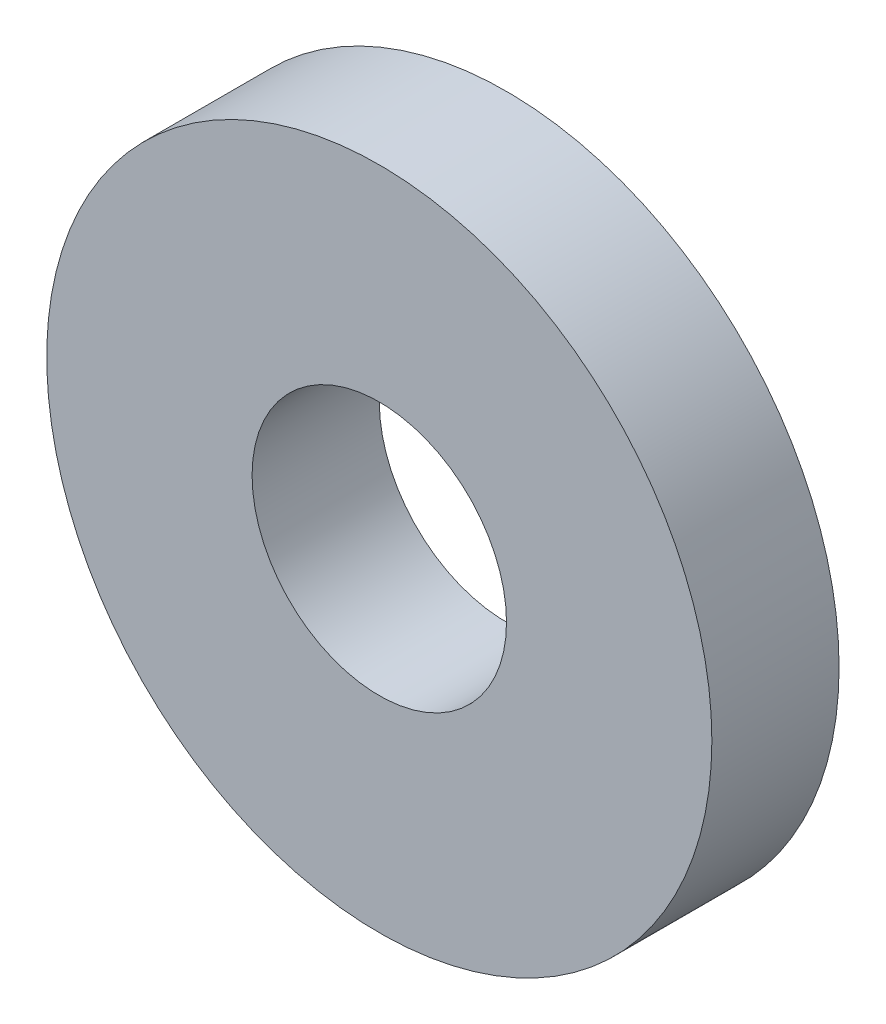
ISO-10303-21;
HEADER;
FILE_DESCRIPTION(('STEP AP214'),'2;1');
FILE_NAME('part.step','',(''),(''),'','','');
FILE_SCHEMA(('AUTOMOTIVE_DESIGN { 1 0 10303 214 1 1 1 1 }'));
ENDSEC;
DATA;
#1=APPLICATION_CONTEXT('core data for automotive mechanical design processes');
#2=APPLICATION_PROTOCOL_DEFINITION('international standard','automotive_design',2000,#1);
#3=PRODUCT_CONTEXT('',#1,'mechanical');
#4=PRODUCT('Part','Part','',(#3));
#5=PRODUCT_RELATED_PRODUCT_CATEGORY('part','',(#4));
#6=PRODUCT_DEFINITION_FORMATION('','',#4);
#7=PRODUCT_DEFINITION_CONTEXT('part definition',#1,'design');
#8=PRODUCT_DEFINITION('design','',#6,#7);
#9=PRODUCT_DEFINITION_SHAPE('','',#8);
#10=(LENGTH_UNIT() NAMED_UNIT(*) SI_UNIT(.MILLI.,.METRE.));
#11=(NAMED_UNIT(*) PLANE_ANGLE_UNIT() SI_UNIT($,.RADIAN.));
#12=(NAMED_UNIT(*) SI_UNIT($,.STERADIAN.) SOLID_ANGLE_UNIT());
#13=UNCERTAINTY_MEASURE_WITH_UNIT(LENGTH_MEASURE(1.E-05),#10,'distance_accuracy_value','');
#14=(GEOMETRIC_REPRESENTATION_CONTEXT(3) GLOBAL_UNCERTAINTY_ASSIGNED_CONTEXT((#13)) GLOBAL_UNIT_ASSIGNED_CONTEXT((#10,
#11,#12)) REPRESENTATION_CONTEXT('',''));
#15=CARTESIAN_POINT('',(0.,0.,0.));
#16=DIRECTION('',(0.,0.,1.));
#17=DIRECTION('',(1.,0.,0.));
#18=AXIS2_PLACEMENT_3D('',#15,#16,#17);
#19=CARTESIAN_POINT('',(8.,0.,1.5875));
#20=DIRECTION('',(0.,0.,1.));
#21=DIRECTION('',(1.,0.,0.));
#22=AXIS2_PLACEMENT_3D('',#19,#20,#21);
#23=PLANE('',#22);
#24=CARTESIAN_POINT('',(8.,0.,1.5875));
#25=DIRECTION('',(0.,0.,1.));
#26=DIRECTION('',(1.,0.,0.));
#27=AXIS2_PLACEMENT_3D('',#24,#25,#26);
#28=CIRCLE('',#27,4.15);
#29=CARTESIAN_POINT('',(12.15,0.,1.5875));
#30=VERTEX_POINT('',#29);
#31=EDGE_CURVE('E10',#30,#30,#28,.T.);
#32=ORIENTED_EDGE('',*,*,#31,.T.);
#33=EDGE_LOOP('',(#32));
#34=FACE_BOUND('',#33,.T.);
#35=CARTESIAN_POINT('',(8.,0.,1.5875));
#36=DIRECTION('',(0.,0.,1.));
#37=DIRECTION('',(1.,0.,0.));
#38=AXIS2_PLACEMENT_3D('',#35,#36,#37);
#39=CIRCLE('',#38,1.5875);
#40=CARTESIAN_POINT('',(9.5875,0.,1.5875));
#41=VERTEX_POINT('',#40);
#42=EDGE_CURVE('E42',#41,#41,#39,.T.);
#43=ORIENTED_EDGE('',*,*,#42,.F.);
#44=EDGE_LOOP('',(#43));
#45=FACE_BOUND('',#44,.T.);
#46=ADVANCED_FACE('F31',(#34,#45),#23,.T.);
#47=CARTESIAN_POINT('',(8.,0.,0.));
#48=DIRECTION('',(0.,0.,1.));
#49=DIRECTION('',(1.,0.,0.));
#50=AXIS2_PLACEMENT_3D('',#47,#48,#49);
#51=PLANE('',#50);
#52=CARTESIAN_POINT('',(8.,0.,0.));
#53=DIRECTION('',(0.,0.,1.));
#54=DIRECTION('',(1.,0.,0.));
#55=AXIS2_PLACEMENT_3D('',#52,#53,#54);
#56=CIRCLE('',#55,4.15);
#57=CARTESIAN_POINT('',(12.15,0.,0.));
#58=VERTEX_POINT('',#57);
#59=EDGE_CURVE('E35',#58,#58,#56,.T.);
#60=ORIENTED_EDGE('',*,*,#59,.F.);
#61=EDGE_LOOP('',(#60));
#62=FACE_BOUND('',#61,.T.);
#63=CARTESIAN_POINT('',(8.,0.,0.));
#64=DIRECTION('',(0.,0.,1.));
#65=DIRECTION('',(1.,0.,0.));
#66=AXIS2_PLACEMENT_3D('',#63,#64,#65);
#67=CIRCLE('',#66,1.5875);
#68=CARTESIAN_POINT('',(9.5875,0.,0.));
#69=VERTEX_POINT('',#68);
#70=EDGE_CURVE('E44',#69,#69,#67,.T.);
#71=ORIENTED_EDGE('',*,*,#70,.T.);
#72=EDGE_LOOP('',(#71));
#73=FACE_BOUND('',#72,.T.);
#74=ADVANCED_FACE('F54',(#62,#73),#51,.F.);
#75=CARTESIAN_POINT('',(8.,0.,1.5875));
#76=DIRECTION('',(0.,0.,-1.));
#77=DIRECTION('',(-1.,0.,0.));
#78=AXIS2_PLACEMENT_3D('',#75,#76,#77);
#79=CYLINDRICAL_SURFACE('',#78,4.15);
#80=ORIENTED_EDGE('',*,*,#31,.F.);
#81=EDGE_LOOP('',(#80));
#82=FACE_BOUND('',#81,.T.);
#83=ORIENTED_EDGE('',*,*,#59,.T.);
#84=EDGE_LOOP('',(#83));
#85=FACE_BOUND('',#84,.T.);
#86=ADVANCED_FACE('F33',(#82,#85),#79,.T.);
#87=CARTESIAN_POINT('',(8.,0.,1.5875));
#88=DIRECTION('',(0.,0.,-1.));
#89=DIRECTION('',(-1.,0.,0.));
#90=AXIS2_PLACEMENT_3D('',#87,#88,#89);
#91=CYLINDRICAL_SURFACE('',#90,1.5875);
#92=ORIENTED_EDGE('',*,*,#42,.T.);
#93=EDGE_LOOP('',(#92));
#94=FACE_BOUND('',#93,.T.);
#95=ORIENTED_EDGE('',*,*,#70,.F.);
#96=EDGE_LOOP('',(#95));
#97=FACE_BOUND('',#96,.T.);
#98=ADVANCED_FACE('F50',(#94,#97),#91,.F.);
#99=CLOSED_SHELL('',(#46,#74,#86,#98));
#100=MANIFOLD_SOLID_BREP('B2',#99);
#101=ADVANCED_BREP_SHAPE_REPRESENTATION('',(#18,#100),#14);
#102=SHAPE_DEFINITION_REPRESENTATION(#9,#101);
ENDSEC;
END-ISO-10303-21;
